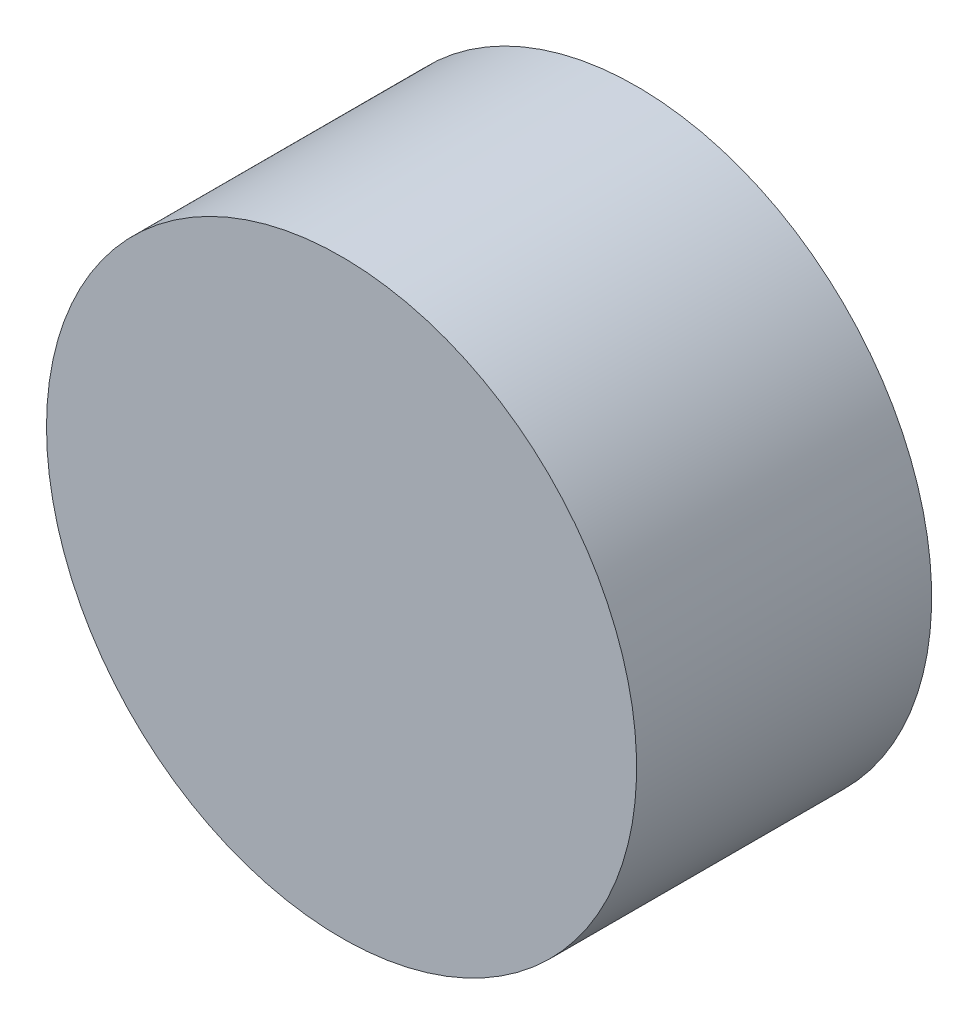
ISO-10303-21;
HEADER;
FILE_DESCRIPTION(('STEP AP214'),'2;1');
FILE_NAME('part.step','',(''),(''),'','','');
FILE_SCHEMA(('AUTOMOTIVE_DESIGN { 1 0 10303 214 1 1 1 1 }'));
ENDSEC;
DATA;
#1=APPLICATION_CONTEXT('core data for automotive mechanical design processes');
#2=APPLICATION_PROTOCOL_DEFINITION('international standard','automotive_design',2000,#1);
#3=PRODUCT_CONTEXT('',#1,'mechanical');
#4=PRODUCT('Part','Part','',(#3));
#5=PRODUCT_RELATED_PRODUCT_CATEGORY('part','',(#4));
#6=PRODUCT_DEFINITION_FORMATION('','',#4);
#7=PRODUCT_DEFINITION_CONTEXT('part definition',#1,'design');
#8=PRODUCT_DEFINITION('design','',#6,#7);
#9=PRODUCT_DEFINITION_SHAPE('','',#8);
#10=(LENGTH_UNIT() NAMED_UNIT(*) SI_UNIT(.MILLI.,.METRE.));
#11=(NAMED_UNIT(*) PLANE_ANGLE_UNIT() SI_UNIT($,.RADIAN.));
#12=(NAMED_UNIT(*) SI_UNIT($,.STERADIAN.) SOLID_ANGLE_UNIT());
#13=UNCERTAINTY_MEASURE_WITH_UNIT(LENGTH_MEASURE(1.E-05),#10,'distance_accuracy_value','');
#14=(GEOMETRIC_REPRESENTATION_CONTEXT(3) GLOBAL_UNCERTAINTY_ASSIGNED_CONTEXT((#13)) GLOBAL_UNIT_ASSIGNED_CONTEXT((#10,
#11,#12)) REPRESENTATION_CONTEXT('',''));
#15=CARTESIAN_POINT('',(0.,0.,0.));
#16=DIRECTION('',(0.,0.,1.));
#17=DIRECTION('',(1.,0.,0.));
#18=AXIS2_PLACEMENT_3D('',#15,#16,#17);
#19=CARTESIAN_POINT('',(0.,0.,0.));
#20=DIRECTION('',(0.,0.,1.));
#21=DIRECTION('',(1.,0.,0.));
#22=AXIS2_PLACEMENT_3D('',#19,#20,#21);
#23=PLANE('',#22);
#24=CARTESIAN_POINT('',(0.,0.,0.));
#25=DIRECTION('',(0.,0.,-1.));
#26=DIRECTION('',(-1.,0.,0.));
#27=AXIS2_PLACEMENT_3D('',#24,#25,#26);
#28=CIRCLE('',#27,0.2);
#29=CARTESIAN_POINT('',(-0.2,0.,0.));
#30=VERTEX_POINT('',#29);
#31=EDGE_CURVE('E18',#30,#30,#28,.F.);
#32=ORIENTED_EDGE('',*,*,#31,.F.);
#33=EDGE_LOOP('',(#32));
#34=FACE_BOUND('',#33,.T.);
#35=ADVANCED_FACE('F15',(#34),#23,.F.);
#36=CARTESIAN_POINT('',(0.,0.,0.2));
#37=DIRECTION('',(0.,0.,1.));
#38=DIRECTION('',(1.,0.,0.));
#39=AXIS2_PLACEMENT_3D('',#36,#37,#38);
#40=PLANE('',#39);
#41=CARTESIAN_POINT('',(0.,0.,0.2));
#42=DIRECTION('',(0.,0.,-1.));
#43=DIRECTION('',(-1.,0.,0.));
#44=AXIS2_PLACEMENT_3D('',#41,#42,#43);
#45=CIRCLE('',#44,0.2);
#46=CARTESIAN_POINT('',(-0.2,0.,0.2));
#47=VERTEX_POINT('',#46);
#48=EDGE_CURVE('E10',#47,#47,#45,.T.);
#49=ORIENTED_EDGE('',*,*,#48,.F.);
#50=EDGE_LOOP('',(#49));
#51=FACE_BOUND('',#50,.T.);
#52=ADVANCED_FACE('F30',(#51),#40,.T.);
#53=CARTESIAN_POINT('',(0.,0.,0.));
#54=DIRECTION('',(0.,0.,-1.));
#55=DIRECTION('',(-1.,0.,0.));
#56=AXIS2_PLACEMENT_3D('',#53,#54,#55);
#57=CYLINDRICAL_SURFACE('',#56,0.2);
#58=ORIENTED_EDGE('',*,*,#48,.T.);
#59=EDGE_LOOP('',(#58));
#60=FACE_BOUND('',#59,.T.);
#61=ORIENTED_EDGE('',*,*,#31,.T.);
#62=EDGE_LOOP('',(#61));
#63=FACE_BOUND('',#62,.T.);
#64=ADVANCED_FACE('F27',(#60,#63),#57,.T.);
#65=CLOSED_SHELL('',(#35,#52,#64));
#66=MANIFOLD_SOLID_BREP('B1',#65);
#67=ADVANCED_BREP_SHAPE_REPRESENTATION('',(#18,#66),#14);
#68=SHAPE_DEFINITION_REPRESENTATION(#9,#67);
ENDSEC;
END-ISO-10303-21;
